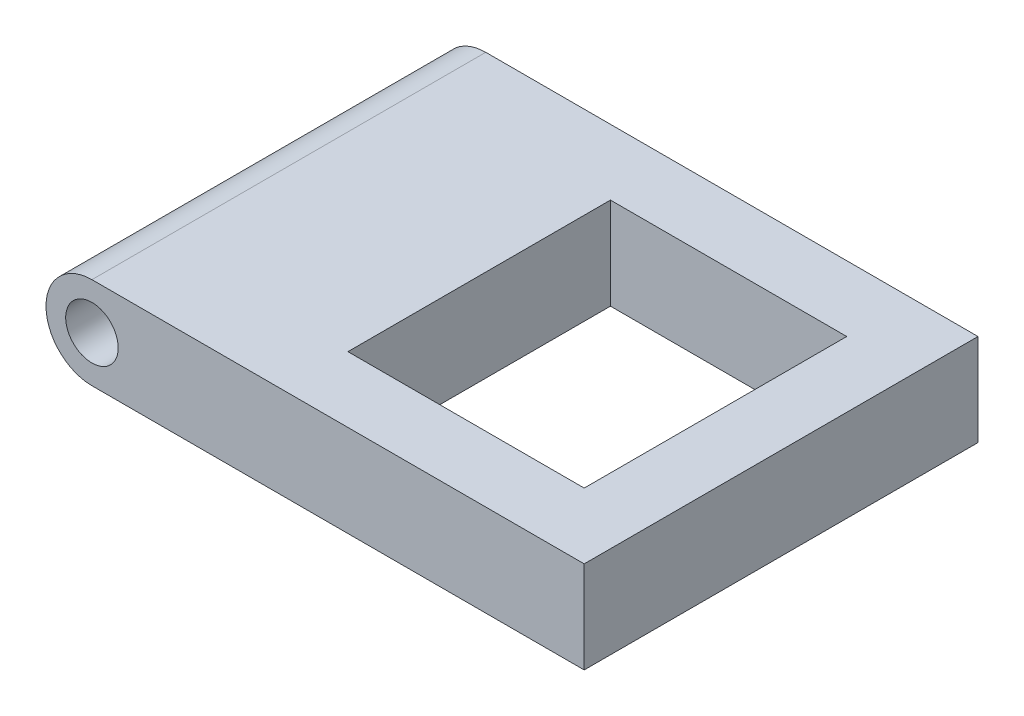
ISO-10303-21;
HEADER;
FILE_DESCRIPTION(('STEP AP214'),'2;1');
FILE_NAME('part.step','',(''),(''),'','','');
FILE_SCHEMA(('AUTOMOTIVE_DESIGN { 1 0 10303 214 1 1 1 1 }'));
ENDSEC;
DATA;
#1=APPLICATION_CONTEXT('core data for automotive mechanical design processes');
#2=APPLICATION_PROTOCOL_DEFINITION('international standard','automotive_design',2000,#1);
#3=PRODUCT_CONTEXT('',#1,'mechanical');
#4=PRODUCT('Part','Part','',(#3));
#5=PRODUCT_RELATED_PRODUCT_CATEGORY('part','',(#4));
#6=PRODUCT_DEFINITION_FORMATION('','',#4);
#7=PRODUCT_DEFINITION_CONTEXT('part definition',#1,'design');
#8=PRODUCT_DEFINITION('design','',#6,#7);
#9=PRODUCT_DEFINITION_SHAPE('','',#8);
#10=(LENGTH_UNIT() NAMED_UNIT(*) SI_UNIT(.MILLI.,.METRE.));
#11=(NAMED_UNIT(*) PLANE_ANGLE_UNIT() SI_UNIT($,.RADIAN.));
#12=(NAMED_UNIT(*) SI_UNIT($,.STERADIAN.) SOLID_ANGLE_UNIT());
#13=UNCERTAINTY_MEASURE_WITH_UNIT(LENGTH_MEASURE(1.E-05),#10,'distance_accuracy_value','');
#14=(GEOMETRIC_REPRESENTATION_CONTEXT(3) GLOBAL_UNCERTAINTY_ASSIGNED_CONTEXT((#13)) GLOBAL_UNIT_ASSIGNED_CONTEXT((#10,
#11,#12)) REPRESENTATION_CONTEXT('',''));
#15=CARTESIAN_POINT('',(0.,0.,0.));
#16=DIRECTION('',(0.,0.,1.));
#17=DIRECTION('',(1.,0.,0.));
#18=AXIS2_PLACEMENT_3D('',#15,#16,#17);
#19=CARTESIAN_POINT('',(0.,14.,0.));
#20=DIRECTION('',(0.,1.,0.));
#21=DIRECTION('',(0.,0.,1.));
#22=AXIS2_PLACEMENT_3D('',#19,#20,#21);
#23=PLANE('',#22);
#24=DIRECTION('',(-1.,0.,0.));
#25=VECTOR('',#24,1.);
#26=CARTESIAN_POINT('',(55.,14.,-60.));
#27=LINE('',#26,#25);
#28=CARTESIAN_POINT('',(55.,14.,-60.));
#29=VERTEX_POINT('',#28);
#30=CARTESIAN_POINT('',(-20.,14.,-60.));
#31=VERTEX_POINT('',#30);
#32=EDGE_CURVE('E113',#29,#31,#27,.T.);
#33=ORIENTED_EDGE('',*,*,#32,.T.);
#34=DIRECTION('',(0.,0.,1.));
#35=VECTOR('',#34,1.);
#36=CARTESIAN_POINT('',(-20.,14.,-60.));
#37=LINE('',#36,#35);
#38=CARTESIAN_POINT('',(-20.,14.,0.));
#39=VERTEX_POINT('',#38);
#40=EDGE_CURVE('E116',#31,#39,#37,.T.);
#41=ORIENTED_EDGE('',*,*,#40,.T.);
#42=DIRECTION('',(1.,0.,0.));
#43=VECTOR('',#42,1.);
#44=CARTESIAN_POINT('',(0.,14.,0.));
#45=LINE('',#44,#43);
#46=CARTESIAN_POINT('',(55.,14.,0.));
#47=VERTEX_POINT('',#46);
#48=EDGE_CURVE('E190',#39,#47,#45,.T.);
#49=ORIENTED_EDGE('',*,*,#48,.T.);
#50=DIRECTION('',(0.,0.,-1.));
#51=VECTOR('',#50,1.);
#52=CARTESIAN_POINT('',(55.,14.,0.));
#53=LINE('',#52,#51);
#54=EDGE_CURVE('E119',#47,#29,#53,.T.);
#55=ORIENTED_EDGE('',*,*,#54,.T.);
#56=EDGE_LOOP('',(#33,#41,#49,#55));
#57=FACE_BOUND('',#56,.T.);
#58=DIRECTION('',(1.,0.,0.));
#59=VECTOR('',#58,1.);
#60=CARTESIAN_POINT('',(9.,14.,-10.));
#61=LINE('',#60,#59);
#62=CARTESIAN_POINT('',(9.,14.,-10.));
#63=VERTEX_POINT('',#62);
#64=CARTESIAN_POINT('',(45.,14.,-10.));
#65=VERTEX_POINT('',#64);
#66=EDGE_CURVE('E155',#63,#65,#61,.T.);
#67=ORIENTED_EDGE('',*,*,#66,.F.);
#68=DIRECTION('',(0.,0.,1.));
#69=VECTOR('',#68,1.);
#70=CARTESIAN_POINT('',(9.,14.,-50.));
#71=LINE('',#70,#69);
#72=CARTESIAN_POINT('',(9.,14.,-50.));
#73=VERTEX_POINT('',#72);
#74=EDGE_CURVE('E152',#73,#63,#71,.T.);
#75=ORIENTED_EDGE('',*,*,#74,.F.);
#76=DIRECTION('',(-1.,0.,0.));
#77=VECTOR('',#76,1.);
#78=CARTESIAN_POINT('',(45.,14.,-50.));
#79=LINE('',#78,#77);
#80=CARTESIAN_POINT('',(45.,14.,-50.));
#81=VERTEX_POINT('',#80);
#82=EDGE_CURVE('E162',#81,#73,#79,.T.);
#83=ORIENTED_EDGE('',*,*,#82,.F.);
#84=DIRECTION('',(0.,0.,-1.));
#85=VECTOR('',#84,1.);
#86=CARTESIAN_POINT('',(45.,14.,-10.));
#87=LINE('',#86,#85);
#88=EDGE_CURVE('E159',#65,#81,#87,.T.);
#89=ORIENTED_EDGE('',*,*,#88,.F.);
#90=EDGE_LOOP('',(#67,#75,#83,#89));
#91=FACE_BOUND('',#90,.T.);
#92=ADVANCED_FACE('F45',(#57,#91),#23,.T.);
#93=CARTESIAN_POINT('',(0.,0.,0.));
#94=DIRECTION('',(0.,1.,0.));
#95=DIRECTION('',(0.,0.,1.));
#96=AXIS2_PLACEMENT_3D('',#93,#94,#95);
#97=PLANE('',#96);
#98=DIRECTION('',(1.,0.,0.));
#99=VECTOR('',#98,1.);
#100=CARTESIAN_POINT('',(0.,0.,0.));
#101=LINE('',#100,#99);
#102=CARTESIAN_POINT('',(-20.,0.,0.));
#103=VERTEX_POINT('',#102);
#104=CARTESIAN_POINT('',(55.,0.,0.));
#105=VERTEX_POINT('',#104);
#106=EDGE_CURVE('E189',#103,#105,#101,.T.);
#107=ORIENTED_EDGE('',*,*,#106,.F.);
#108=DIRECTION('',(0.,0.,1.));
#109=VECTOR('',#108,1.);
#110=CARTESIAN_POINT('',(-20.,0.,-60.));
#111=LINE('',#110,#109);
#112=CARTESIAN_POINT('',(-20.,0.,-60.));
#113=VERTEX_POINT('',#112);
#114=EDGE_CURVE('E134',#113,#103,#111,.T.);
#115=ORIENTED_EDGE('',*,*,#114,.F.);
#116=DIRECTION('',(-1.,0.,0.));
#117=VECTOR('',#116,1.);
#118=CARTESIAN_POINT('',(55.,0.,-60.));
#119=LINE('',#118,#117);
#120=CARTESIAN_POINT('',(55.,0.,-60.));
#121=VERTEX_POINT('',#120);
#122=EDGE_CURVE('E139',#121,#113,#119,.T.);
#123=ORIENTED_EDGE('',*,*,#122,.F.);
#124=DIRECTION('',(0.,0.,-1.));
#125=VECTOR('',#124,1.);
#126=CARTESIAN_POINT('',(55.,0.,0.));
#127=LINE('',#126,#125);
#128=EDGE_CURVE('E197',#105,#121,#127,.T.);
#129=ORIENTED_EDGE('',*,*,#128,.F.);
#130=EDGE_LOOP('',(#107,#115,#123,#129));
#131=FACE_BOUND('',#130,.T.);
#132=DIRECTION('',(0.,0.,1.));
#133=VECTOR('',#132,1.);
#134=CARTESIAN_POINT('',(9.,0.,-50.));
#135=LINE('',#134,#133);
#136=CARTESIAN_POINT('',(9.,0.,-50.));
#137=VERTEX_POINT('',#136);
#138=CARTESIAN_POINT('',(9.,0.,-10.));
#139=VERTEX_POINT('',#138);
#140=EDGE_CURVE('E69',#137,#139,#135,.T.);
#141=ORIENTED_EDGE('',*,*,#140,.T.);
#142=DIRECTION('',(1.,0.,0.));
#143=VECTOR('',#142,1.);
#144=CARTESIAN_POINT('',(9.,0.,-10.));
#145=LINE('',#144,#143);
#146=CARTESIAN_POINT('',(45.,0.,-10.));
#147=VERTEX_POINT('',#146);
#148=EDGE_CURVE('E168',#139,#147,#145,.T.);
#149=ORIENTED_EDGE('',*,*,#148,.T.);
#150=DIRECTION('',(0.,0.,-1.));
#151=VECTOR('',#150,1.);
#152=CARTESIAN_POINT('',(45.,0.,-10.));
#153=LINE('',#152,#151);
#154=CARTESIAN_POINT('',(45.,0.,-50.));
#155=VERTEX_POINT('',#154);
#156=EDGE_CURVE('E172',#147,#155,#153,.T.);
#157=ORIENTED_EDGE('',*,*,#156,.T.);
#158=DIRECTION('',(-1.,0.,0.));
#159=VECTOR('',#158,1.);
#160=CARTESIAN_POINT('',(45.,0.,-50.));
#161=LINE('',#160,#159);
#162=EDGE_CURVE('E156',#155,#137,#161,.T.);
#163=ORIENTED_EDGE('',*,*,#162,.T.);
#164=EDGE_LOOP('',(#141,#149,#157,#163));
#165=FACE_BOUND('',#164,.T.);
#166=ADVANCED_FACE('F205',(#131,#165),#97,.F.);
#167=CARTESIAN_POINT('',(0.,14.,0.));
#168=DIRECTION('',(0.,0.,-1.));
#169=DIRECTION('',(-1.,0.,0.));
#170=AXIS2_PLACEMENT_3D('',#167,#168,#169);
#171=PLANE('',#170);
#172=ORIENTED_EDGE('',*,*,#106,.T.);
#173=DIRECTION('',(0.,-1.,0.));
#174=VECTOR('',#173,1.);
#175=CARTESIAN_POINT('',(55.,14.,0.));
#176=LINE('',#175,#174);
#177=EDGE_CURVE('E11',#47,#105,#176,.T.);
#178=ORIENTED_EDGE('',*,*,#177,.F.);
#179=ORIENTED_EDGE('',*,*,#48,.F.);
#180=CARTESIAN_POINT('',(-20.,7.,0.));
#181=DIRECTION('',(0.,0.,1.));
#182=DIRECTION('',(1.,0.,0.));
#183=AXIS2_PLACEMENT_3D('',#180,#181,#182);
#184=CIRCLE('',#183,7.);
#185=EDGE_CURVE('E132',#39,#103,#184,.T.);
#186=ORIENTED_EDGE('',*,*,#185,.T.);
#187=EDGE_LOOP('',(#172,#178,#179,#186));
#188=FACE_BOUND('',#187,.T.);
#189=CARTESIAN_POINT('',(-20.,7.,0.));
#190=DIRECTION('',(0.,0.,1.));
#191=DIRECTION('',(1.,0.,0.));
#192=AXIS2_PLACEMENT_3D('',#189,#190,#191);
#193=CIRCLE('',#192,4.);
#194=CARTESIAN_POINT('',(-16.,7.,0.));
#195=VERTEX_POINT('',#194);
#196=EDGE_CURVE('E147',#195,#195,#193,.T.);
#197=ORIENTED_EDGE('',*,*,#196,.F.);
#198=EDGE_LOOP('',(#197));
#199=FACE_BOUND('',#198,.T.);
#200=ADVANCED_FACE('F47',(#188,#199),#171,.F.);
#201=CARTESIAN_POINT('',(55.,14.,0.));
#202=DIRECTION('',(-1.,0.,0.));
#203=DIRECTION('',(0.,0.,1.));
#204=AXIS2_PLACEMENT_3D('',#201,#202,#203);
#205=PLANE('',#204);
#206=ORIENTED_EDGE('',*,*,#128,.T.);
#207=DIRECTION('',(0.,-1.,0.));
#208=VECTOR('',#207,1.);
#209=CARTESIAN_POINT('',(55.,14.,-60.));
#210=LINE('',#209,#208);
#211=EDGE_CURVE('E54',#29,#121,#210,.T.);
#212=ORIENTED_EDGE('',*,*,#211,.F.);
#213=ORIENTED_EDGE('',*,*,#54,.F.);
#214=ORIENTED_EDGE('',*,*,#177,.T.);
#215=EDGE_LOOP('',(#206,#212,#213,#214));
#216=FACE_BOUND('',#215,.T.);
#217=ADVANCED_FACE('F210',(#216),#205,.F.);
#218=CARTESIAN_POINT('',(55.,14.,-60.));
#219=DIRECTION('',(0.,0.,1.));
#220=DIRECTION('',(1.,0.,0.));
#221=AXIS2_PLACEMENT_3D('',#218,#219,#220);
#222=PLANE('',#221);
#223=ORIENTED_EDGE('',*,*,#122,.T.);
#224=CARTESIAN_POINT('',(-20.,7.,-60.));
#225=DIRECTION('',(0.,0.,1.));
#226=DIRECTION('',(1.,0.,0.));
#227=AXIS2_PLACEMENT_3D('',#224,#225,#226);
#228=CIRCLE('',#227,7.);
#229=EDGE_CURVE('E130',#31,#113,#228,.T.);
#230=ORIENTED_EDGE('',*,*,#229,.F.);
#231=ORIENTED_EDGE('',*,*,#32,.F.);
#232=ORIENTED_EDGE('',*,*,#211,.T.);
#233=EDGE_LOOP('',(#223,#230,#231,#232));
#234=FACE_BOUND('',#233,.T.);
#235=CARTESIAN_POINT('',(-20.,7.,-60.));
#236=DIRECTION('',(0.,0.,1.));
#237=DIRECTION('',(1.,0.,0.));
#238=AXIS2_PLACEMENT_3D('',#235,#236,#237);
#239=CIRCLE('',#238,4.);
#240=CARTESIAN_POINT('',(-16.,7.,-60.));
#241=VERTEX_POINT('',#240);
#242=EDGE_CURVE('E144',#241,#241,#239,.T.);
#243=ORIENTED_EDGE('',*,*,#242,.T.);
#244=EDGE_LOOP('',(#243));
#245=FACE_BOUND('',#244,.T.);
#246=ADVANCED_FACE('F136',(#234,#245),#222,.F.);
#247=CARTESIAN_POINT('',(9.,14.,-50.));
#248=DIRECTION('',(1.,0.,0.));
#249=DIRECTION('',(0.,0.,-1.));
#250=AXIS2_PLACEMENT_3D('',#247,#248,#249);
#251=PLANE('',#250);
#252=ORIENTED_EDGE('',*,*,#140,.F.);
#253=DIRECTION('',(0.,-1.,0.));
#254=VECTOR('',#253,1.);
#255=CARTESIAN_POINT('',(9.,14.,-50.));
#256=LINE('',#255,#254);
#257=EDGE_CURVE('E165',#73,#137,#256,.T.);
#258=ORIENTED_EDGE('',*,*,#257,.F.);
#259=ORIENTED_EDGE('',*,*,#74,.T.);
#260=DIRECTION('',(0.,-1.,0.));
#261=VECTOR('',#260,1.);
#262=CARTESIAN_POINT('',(9.,14.,-10.));
#263=LINE('',#262,#261);
#264=EDGE_CURVE('E186',#63,#139,#263,.T.);
#265=ORIENTED_EDGE('',*,*,#264,.T.);
#266=EDGE_LOOP('',(#252,#258,#259,#265));
#267=FACE_BOUND('',#266,.T.);
#268=ADVANCED_FACE('F216',(#267),#251,.T.);
#269=CARTESIAN_POINT('',(9.,14.,-10.));
#270=DIRECTION('',(0.,0.,-1.));
#271=DIRECTION('',(-1.,0.,0.));
#272=AXIS2_PLACEMENT_3D('',#269,#270,#271);
#273=PLANE('',#272);
#274=ORIENTED_EDGE('',*,*,#148,.F.);
#275=ORIENTED_EDGE('',*,*,#264,.F.);
#276=ORIENTED_EDGE('',*,*,#66,.T.);
#277=DIRECTION('',(0.,-1.,0.));
#278=VECTOR('',#277,1.);
#279=CARTESIAN_POINT('',(45.,14.,-10.));
#280=LINE('',#279,#278);
#281=EDGE_CURVE('E183',#65,#147,#280,.T.);
#282=ORIENTED_EDGE('',*,*,#281,.T.);
#283=EDGE_LOOP('',(#274,#275,#276,#282));
#284=FACE_BOUND('',#283,.T.);
#285=ADVANCED_FACE('F228',(#284),#273,.T.);
#286=CARTESIAN_POINT('',(45.,14.,-10.));
#287=DIRECTION('',(-1.,0.,0.));
#288=DIRECTION('',(0.,0.,1.));
#289=AXIS2_PLACEMENT_3D('',#286,#287,#288);
#290=PLANE('',#289);
#291=ORIENTED_EDGE('',*,*,#156,.F.);
#292=ORIENTED_EDGE('',*,*,#281,.F.);
#293=ORIENTED_EDGE('',*,*,#88,.T.);
#294=DIRECTION('',(0.,-1.,0.));
#295=VECTOR('',#294,1.);
#296=CARTESIAN_POINT('',(45.,14.,-50.));
#297=LINE('',#296,#295);
#298=EDGE_CURVE('E61',#81,#155,#297,.T.);
#299=ORIENTED_EDGE('',*,*,#298,.T.);
#300=EDGE_LOOP('',(#291,#292,#293,#299));
#301=FACE_BOUND('',#300,.T.);
#302=ADVANCED_FACE('F231',(#301),#290,.T.);
#303=CARTESIAN_POINT('',(45.,14.,-50.));
#304=DIRECTION('',(0.,0.,1.));
#305=DIRECTION('',(1.,0.,0.));
#306=AXIS2_PLACEMENT_3D('',#303,#304,#305);
#307=PLANE('',#306);
#308=ORIENTED_EDGE('',*,*,#162,.F.);
#309=ORIENTED_EDGE('',*,*,#298,.F.);
#310=ORIENTED_EDGE('',*,*,#82,.T.);
#311=ORIENTED_EDGE('',*,*,#257,.T.);
#312=EDGE_LOOP('',(#308,#309,#310,#311));
#313=FACE_BOUND('',#312,.T.);
#314=ADVANCED_FACE('F235',(#313),#307,.T.);
#315=CARTESIAN_POINT('',(-20.,7.,-60.));
#316=DIRECTION('',(0.,0.,1.));
#317=DIRECTION('',(1.,0.,0.));
#318=AXIS2_PLACEMENT_3D('',#315,#316,#317);
#319=CYLINDRICAL_SURFACE('',#318,7.);
#320=ORIENTED_EDGE('',*,*,#185,.F.);
#321=ORIENTED_EDGE('',*,*,#40,.F.);
#322=ORIENTED_EDGE('',*,*,#229,.T.);
#323=ORIENTED_EDGE('',*,*,#114,.T.);
#324=EDGE_LOOP('',(#320,#321,#322,#323));
#325=FACE_BOUND('',#324,.T.);
#326=ADVANCED_FACE('F128',(#325),#319,.T.);
#327=CARTESIAN_POINT('',(-20.,7.,-60.));
#328=DIRECTION('',(0.,0.,1.));
#329=DIRECTION('',(1.,0.,0.));
#330=AXIS2_PLACEMENT_3D('',#327,#328,#329);
#331=CYLINDRICAL_SURFACE('',#330,4.);
#332=ORIENTED_EDGE('',*,*,#242,.F.);
#333=EDGE_LOOP('',(#332));
#334=FACE_BOUND('',#333,.T.);
#335=ORIENTED_EDGE('',*,*,#196,.T.);
#336=EDGE_LOOP('',(#335));
#337=FACE_BOUND('',#336,.T.);
#338=ADVANCED_FACE('F240',(#334,#337),#331,.F.);
#339=CLOSED_SHELL('',(#92,#166,#200,#217,#246,#268,#285,#302,#314,#326,#338));
#340=MANIFOLD_SOLID_BREP('B2',#339);
#341=ADVANCED_BREP_SHAPE_REPRESENTATION('',(#18,#340),#14);
#342=SHAPE_DEFINITION_REPRESENTATION(#9,#341);
ENDSEC;
END-ISO-10303-21;
